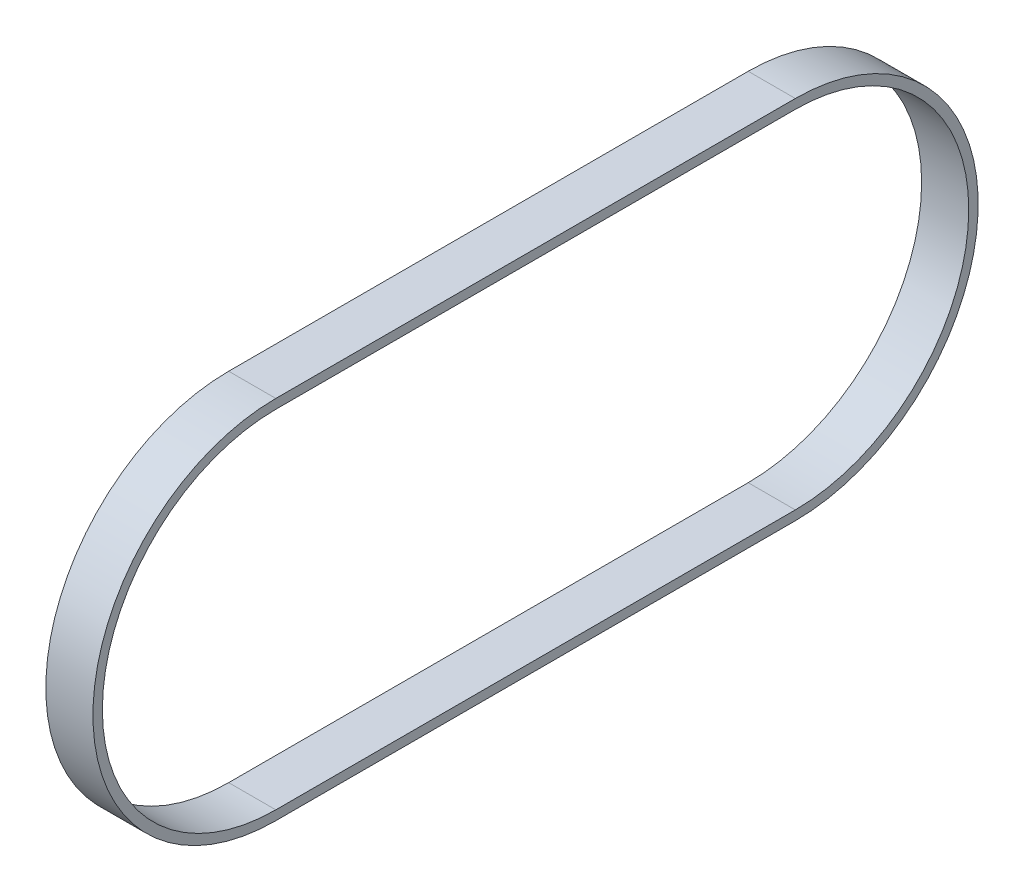
ISO-10303-21;
HEADER;
FILE_DESCRIPTION(('STEP AP214'),'2;1');
FILE_NAME('part.step','',(''),(''),'','','');
FILE_SCHEMA(('AUTOMOTIVE_DESIGN { 1 0 10303 214 1 1 1 1 }'));
ENDSEC;
DATA;
#1=APPLICATION_CONTEXT('core data for automotive mechanical design processes');
#2=APPLICATION_PROTOCOL_DEFINITION('international standard','automotive_design',2000,#1);
#3=PRODUCT_CONTEXT('',#1,'mechanical');
#4=PRODUCT('Part','Part','',(#3));
#5=PRODUCT_RELATED_PRODUCT_CATEGORY('part','',(#4));
#6=PRODUCT_DEFINITION_FORMATION('','',#4);
#7=PRODUCT_DEFINITION_CONTEXT('part definition',#1,'design');
#8=PRODUCT_DEFINITION('design','',#6,#7);
#9=PRODUCT_DEFINITION_SHAPE('','',#8);
#10=(LENGTH_UNIT() NAMED_UNIT(*) SI_UNIT(.MILLI.,.METRE.));
#11=(NAMED_UNIT(*) PLANE_ANGLE_UNIT() SI_UNIT($,.RADIAN.));
#12=(NAMED_UNIT(*) SI_UNIT($,.STERADIAN.) SOLID_ANGLE_UNIT());
#13=UNCERTAINTY_MEASURE_WITH_UNIT(LENGTH_MEASURE(1.E-05),#10,'distance_accuracy_value','');
#14=(GEOMETRIC_REPRESENTATION_CONTEXT(3) GLOBAL_UNCERTAINTY_ASSIGNED_CONTEXT((#13)) GLOBAL_UNIT_ASSIGNED_CONTEXT((#10,
#11,#12)) REPRESENTATION_CONTEXT('',''));
#15=CARTESIAN_POINT('',(0.,0.,0.));
#16=DIRECTION('',(0.,0.,1.));
#17=DIRECTION('',(1.,0.,0.));
#18=AXIS2_PLACEMENT_3D('',#15,#16,#17);
#19=CARTESIAN_POINT('',(3.175,0.,0.));
#20=DIRECTION('',(1.,0.,0.));
#21=DIRECTION('',(0.,0.,-1.));
#22=AXIS2_PLACEMENT_3D('',#19,#20,#21);
#23=PLANE('',#22);
#24=CARTESIAN_POINT('',(3.175,0.,0.));
#25=DIRECTION('',(1.,0.,0.));
#26=DIRECTION('',(0.,0.,-1.));
#27=AXIS2_PLACEMENT_3D('',#24,#25,#26);
#28=CIRCLE('',#27,12.319);
#29=CARTESIAN_POINT('',(3.175,12.319,0.));
#30=VERTEX_POINT('',#29);
#31=CARTESIAN_POINT('',(3.175,-12.319,0.));
#32=VERTEX_POINT('',#31);
#33=EDGE_CURVE('E133',#30,#32,#28,.T.);
#34=ORIENTED_EDGE('',*,*,#33,.T.);
#35=DIRECTION('',(0.,0.,-1.));
#36=VECTOR('',#35,1.);
#37=CARTESIAN_POINT('',(3.175,-12.319,0.));
#38=LINE('',#37,#36);
#39=CARTESIAN_POINT('',(3.175,-12.319,-35.));
#40=VERTEX_POINT('',#39);
#41=EDGE_CURVE('E136',#32,#40,#38,.T.);
#42=ORIENTED_EDGE('',*,*,#41,.T.);
#43=CARTESIAN_POINT('',(3.175,0.,-35.));
#44=DIRECTION('',(1.,0.,0.));
#45=DIRECTION('',(0.,0.,-1.));
#46=AXIS2_PLACEMENT_3D('',#43,#44,#45);
#47=CIRCLE('',#46,12.319);
#48=CARTESIAN_POINT('',(3.175,12.319,-35.));
#49=VERTEX_POINT('',#48);
#50=EDGE_CURVE('E139',#40,#49,#47,.T.);
#51=ORIENTED_EDGE('',*,*,#50,.T.);
#52=DIRECTION('',(0.,0.,1.));
#53=VECTOR('',#52,1.);
#54=CARTESIAN_POINT('',(3.175,12.319,-35.));
#55=LINE('',#54,#53);
#56=EDGE_CURVE('E141',#49,#30,#55,.T.);
#57=ORIENTED_EDGE('',*,*,#56,.T.);
#58=EDGE_LOOP('',(#34,#42,#51,#57));
#59=FACE_BOUND('',#58,.T.);
#60=DIRECTION('',(0.,0.,-1.));
#61=VECTOR('',#60,1.);
#62=CARTESIAN_POINT('',(3.175,-11.684,-35.));
#63=LINE('',#62,#61);
#64=CARTESIAN_POINT('',(3.175,-11.684,0.));
#65=VERTEX_POINT('',#64);
#66=CARTESIAN_POINT('',(3.175,-11.684,-35.));
#67=VERTEX_POINT('',#66);
#68=EDGE_CURVE('E105',#65,#67,#63,.T.);
#69=ORIENTED_EDGE('',*,*,#68,.F.);
#70=CARTESIAN_POINT('',(3.175,0.,0.));
#71=DIRECTION('',(1.,0.,0.));
#72=DIRECTION('',(0.,0.,-1.));
#73=AXIS2_PLACEMENT_3D('',#70,#71,#72);
#74=CIRCLE('',#73,11.684);
#75=CARTESIAN_POINT('',(3.175,11.684,0.));
#76=VERTEX_POINT('',#75);
#77=EDGE_CURVE('E97',#76,#65,#74,.T.);
#78=ORIENTED_EDGE('',*,*,#77,.F.);
#79=DIRECTION('',(0.,0.,1.));
#80=VECTOR('',#79,1.);
#81=CARTESIAN_POINT('',(3.175,11.684,0.));
#82=LINE('',#81,#80);
#83=CARTESIAN_POINT('',(3.175,11.684,-35.));
#84=VERTEX_POINT('',#83);
#85=EDGE_CURVE('E119',#84,#76,#82,.T.);
#86=ORIENTED_EDGE('',*,*,#85,.F.);
#87=CARTESIAN_POINT('',(3.175,0.,-35.));
#88=DIRECTION('',(1.,0.,0.));
#89=DIRECTION('',(0.,0.,1.));
#90=AXIS2_PLACEMENT_3D('',#87,#88,#89);
#91=CIRCLE('',#90,11.684);
#92=EDGE_CURVE('E117',#67,#84,#91,.T.);
#93=ORIENTED_EDGE('',*,*,#92,.F.);
#94=EDGE_LOOP('',(#69,#78,#86,#93));
#95=FACE_BOUND('',#94,.T.);
#96=ADVANCED_FACE('F32',(#59,#95),#23,.T.);
#97=CARTESIAN_POINT('',(0.,0.,0.));
#98=DIRECTION('',(1.,0.,0.));
#99=DIRECTION('',(0.,0.,-1.));
#100=AXIS2_PLACEMENT_3D('',#97,#98,#99);
#101=PLANE('',#100);
#102=CARTESIAN_POINT('',(0.,0.,0.));
#103=DIRECTION('',(1.,0.,0.));
#104=DIRECTION('',(0.,0.,-1.));
#105=AXIS2_PLACEMENT_3D('',#102,#103,#104);
#106=CIRCLE('',#105,12.319);
#107=CARTESIAN_POINT('',(0.,12.319,0.));
#108=VERTEX_POINT('',#107);
#109=CARTESIAN_POINT('',(0.,-12.319,0.));
#110=VERTEX_POINT('',#109);
#111=EDGE_CURVE('E113',#108,#110,#106,.T.);
#112=ORIENTED_EDGE('',*,*,#111,.F.);
#113=DIRECTION('',(0.,0.,1.));
#114=VECTOR('',#113,1.);
#115=CARTESIAN_POINT('',(0.,12.319,-35.));
#116=LINE('',#115,#114);
#117=CARTESIAN_POINT('',(0.,12.319,-35.));
#118=VERTEX_POINT('',#117);
#119=EDGE_CURVE('E137',#118,#108,#116,.T.);
#120=ORIENTED_EDGE('',*,*,#119,.F.);
#121=CARTESIAN_POINT('',(0.,0.,-35.));
#122=DIRECTION('',(1.,0.,0.));
#123=DIRECTION('',(0.,0.,-1.));
#124=AXIS2_PLACEMENT_3D('',#121,#122,#123);
#125=CIRCLE('',#124,12.319);
#126=CARTESIAN_POINT('',(0.,-12.319,-35.));
#127=VERTEX_POINT('',#126);
#128=EDGE_CURVE('E148',#127,#118,#125,.T.);
#129=ORIENTED_EDGE('',*,*,#128,.F.);
#130=DIRECTION('',(0.,0.,-1.));
#131=VECTOR('',#130,1.);
#132=CARTESIAN_POINT('',(0.,-12.319,0.));
#133=LINE('',#132,#131);
#134=EDGE_CURVE('E146',#110,#127,#133,.T.);
#135=ORIENTED_EDGE('',*,*,#134,.F.);
#136=EDGE_LOOP('',(#112,#120,#129,#135));
#137=FACE_BOUND('',#136,.T.);
#138=CARTESIAN_POINT('',(0.,0.,0.));
#139=DIRECTION('',(1.,0.,0.));
#140=DIRECTION('',(0.,0.,-1.));
#141=AXIS2_PLACEMENT_3D('',#138,#139,#140);
#142=CIRCLE('',#141,11.684);
#143=CARTESIAN_POINT('',(0.,11.684,0.));
#144=VERTEX_POINT('',#143);
#145=CARTESIAN_POINT('',(0.,-11.684,0.));
#146=VERTEX_POINT('',#145);
#147=EDGE_CURVE('E55',#144,#146,#142,.T.);
#148=ORIENTED_EDGE('',*,*,#147,.T.);
#149=DIRECTION('',(0.,0.,-1.));
#150=VECTOR('',#149,1.);
#151=CARTESIAN_POINT('',(0.,-11.684,-35.));
#152=LINE('',#151,#150);
#153=CARTESIAN_POINT('',(0.,-11.684,-35.));
#154=VERTEX_POINT('',#153);
#155=EDGE_CURVE('E112',#146,#154,#152,.T.);
#156=ORIENTED_EDGE('',*,*,#155,.T.);
#157=CARTESIAN_POINT('',(0.,0.,-35.));
#158=DIRECTION('',(1.,0.,0.));
#159=DIRECTION('',(0.,0.,1.));
#160=AXIS2_PLACEMENT_3D('',#157,#158,#159);
#161=CIRCLE('',#160,11.684);
#162=CARTESIAN_POINT('',(0.,11.684,-35.));
#163=VERTEX_POINT('',#162);
#164=EDGE_CURVE('E125',#154,#163,#161,.T.);
#165=ORIENTED_EDGE('',*,*,#164,.T.);
#166=DIRECTION('',(0.,0.,1.));
#167=VECTOR('',#166,1.);
#168=CARTESIAN_POINT('',(0.,11.684,0.));
#169=LINE('',#168,#167);
#170=EDGE_CURVE('E106',#163,#144,#169,.T.);
#171=ORIENTED_EDGE('',*,*,#170,.T.);
#172=EDGE_LOOP('',(#148,#156,#165,#171));
#173=FACE_BOUND('',#172,.T.);
#174=ADVANCED_FACE('F166',(#137,#173),#101,.F.);
#175=CARTESIAN_POINT('',(3.175,0.,0.));
#176=DIRECTION('',(-1.,0.,0.));
#177=DIRECTION('',(0.,0.,1.));
#178=AXIS2_PLACEMENT_3D('',#175,#176,#177);
#179=CYLINDRICAL_SURFACE('',#178,12.319);
#180=ORIENTED_EDGE('',*,*,#111,.T.);
#181=DIRECTION('',(-1.,0.,0.));
#182=VECTOR('',#181,1.);
#183=CARTESIAN_POINT('',(3.175,-12.319,0.));
#184=LINE('',#183,#182);
#185=EDGE_CURVE('E11',#32,#110,#184,.T.);
#186=ORIENTED_EDGE('',*,*,#185,.F.);
#187=ORIENTED_EDGE('',*,*,#33,.F.);
#188=DIRECTION('',(-1.,0.,0.));
#189=VECTOR('',#188,1.);
#190=CARTESIAN_POINT('',(3.175,12.319,0.));
#191=LINE('',#190,#189);
#192=EDGE_CURVE('E143',#30,#108,#191,.T.);
#193=ORIENTED_EDGE('',*,*,#192,.T.);
#194=EDGE_LOOP('',(#180,#186,#187,#193));
#195=FACE_BOUND('',#194,.T.);
#196=ADVANCED_FACE('F34',(#195),#179,.T.);
#197=CARTESIAN_POINT('',(3.175,-12.319,0.));
#198=DIRECTION('',(0.,1.,0.));
#199=DIRECTION('',(0.,0.,1.));
#200=AXIS2_PLACEMENT_3D('',#197,#198,#199);
#201=PLANE('',#200);
#202=ORIENTED_EDGE('',*,*,#134,.T.);
#203=DIRECTION('',(-1.,0.,0.));
#204=VECTOR('',#203,1.);
#205=CARTESIAN_POINT('',(3.175,-12.319,-35.));
#206=LINE('',#205,#204);
#207=EDGE_CURVE('E40',#40,#127,#206,.T.);
#208=ORIENTED_EDGE('',*,*,#207,.F.);
#209=ORIENTED_EDGE('',*,*,#41,.F.);
#210=ORIENTED_EDGE('',*,*,#185,.T.);
#211=EDGE_LOOP('',(#202,#208,#209,#210));
#212=FACE_BOUND('',#211,.T.);
#213=ADVANCED_FACE('F176',(#212),#201,.F.);
#214=CARTESIAN_POINT('',(3.175,0.,-35.));
#215=DIRECTION('',(-1.,0.,0.));
#216=DIRECTION('',(0.,0.,1.));
#217=AXIS2_PLACEMENT_3D('',#214,#215,#216);
#218=CYLINDRICAL_SURFACE('',#217,12.319);
#219=ORIENTED_EDGE('',*,*,#128,.T.);
#220=DIRECTION('',(-1.,0.,0.));
#221=VECTOR('',#220,1.);
#222=CARTESIAN_POINT('',(3.175,12.319,-35.));
#223=LINE('',#222,#221);
#224=EDGE_CURVE('E153',#49,#118,#223,.T.);
#225=ORIENTED_EDGE('',*,*,#224,.F.);
#226=ORIENTED_EDGE('',*,*,#50,.F.);
#227=ORIENTED_EDGE('',*,*,#207,.T.);
#228=EDGE_LOOP('',(#219,#225,#226,#227));
#229=FACE_BOUND('',#228,.T.);
#230=ADVANCED_FACE('F160',(#229),#218,.T.);
#231=CARTESIAN_POINT('',(3.175,12.319,-35.));
#232=DIRECTION('',(0.,-1.,0.));
#233=DIRECTION('',(0.,0.,-1.));
#234=AXIS2_PLACEMENT_3D('',#231,#232,#233);
#235=PLANE('',#234);
#236=ORIENTED_EDGE('',*,*,#119,.T.);
#237=ORIENTED_EDGE('',*,*,#192,.F.);
#238=ORIENTED_EDGE('',*,*,#56,.F.);
#239=ORIENTED_EDGE('',*,*,#224,.T.);
#240=EDGE_LOOP('',(#236,#237,#238,#239));
#241=FACE_BOUND('',#240,.T.);
#242=ADVANCED_FACE('F170',(#241),#235,.F.);
#243=CARTESIAN_POINT('',(3.175,0.,0.));
#244=DIRECTION('',(-1.,0.,0.));
#245=DIRECTION('',(0.,0.,1.));
#246=AXIS2_PLACEMENT_3D('',#243,#244,#245);
#247=CYLINDRICAL_SURFACE('',#246,11.684);
#248=ORIENTED_EDGE('',*,*,#147,.F.);
#249=DIRECTION('',(-1.,0.,0.));
#250=VECTOR('',#249,1.);
#251=CARTESIAN_POINT('',(3.175,11.684,0.));
#252=LINE('',#251,#250);
#253=EDGE_CURVE('E101',#76,#144,#252,.T.);
#254=ORIENTED_EDGE('',*,*,#253,.F.);
#255=ORIENTED_EDGE('',*,*,#77,.T.);
#256=DIRECTION('',(-1.,0.,0.));
#257=VECTOR('',#256,1.);
#258=CARTESIAN_POINT('',(3.175,-11.684,0.));
#259=LINE('',#258,#257);
#260=EDGE_CURVE('E100',#65,#146,#259,.T.);
#261=ORIENTED_EDGE('',*,*,#260,.T.);
#262=EDGE_LOOP('',(#248,#254,#255,#261));
#263=FACE_BOUND('',#262,.T.);
#264=ADVANCED_FACE('F99',(#263),#247,.F.);
#265=CARTESIAN_POINT('',(3.175,-11.684,-35.));
#266=DIRECTION('',(0.,1.,0.));
#267=DIRECTION('',(0.,0.,1.));
#268=AXIS2_PLACEMENT_3D('',#265,#266,#267);
#269=PLANE('',#268);
#270=ORIENTED_EDGE('',*,*,#155,.F.);
#271=ORIENTED_EDGE('',*,*,#260,.F.);
#272=ORIENTED_EDGE('',*,*,#68,.T.);
#273=DIRECTION('',(-1.,0.,0.));
#274=VECTOR('',#273,1.);
#275=CARTESIAN_POINT('',(3.175,-11.684,-35.));
#276=LINE('',#275,#274);
#277=EDGE_CURVE('E114',#67,#154,#276,.T.);
#278=ORIENTED_EDGE('',*,*,#277,.T.);
#279=EDGE_LOOP('',(#270,#271,#272,#278));
#280=FACE_BOUND('',#279,.T.);
#281=ADVANCED_FACE('F109',(#280),#269,.T.);
#282=CARTESIAN_POINT('',(3.175,0.,-35.));
#283=DIRECTION('',(-1.,0.,0.));
#284=DIRECTION('',(0.,0.,1.));
#285=AXIS2_PLACEMENT_3D('',#282,#283,#284);
#286=CYLINDRICAL_SURFACE('',#285,11.684);
#287=ORIENTED_EDGE('',*,*,#164,.F.);
#288=ORIENTED_EDGE('',*,*,#277,.F.);
#289=ORIENTED_EDGE('',*,*,#92,.T.);
#290=DIRECTION('',(-1.,0.,0.));
#291=VECTOR('',#290,1.);
#292=CARTESIAN_POINT('',(3.175,11.684,-35.));
#293=LINE('',#292,#291);
#294=EDGE_CURVE('E47',#84,#163,#293,.T.);
#295=ORIENTED_EDGE('',*,*,#294,.T.);
#296=EDGE_LOOP('',(#287,#288,#289,#295));
#297=FACE_BOUND('',#296,.T.);
#298=ADVANCED_FACE('F199',(#297),#286,.F.);
#299=CARTESIAN_POINT('',(3.175,11.684,0.));
#300=DIRECTION('',(0.,-1.,0.));
#301=DIRECTION('',(0.,0.,-1.));
#302=AXIS2_PLACEMENT_3D('',#299,#300,#301);
#303=PLANE('',#302);
#304=ORIENTED_EDGE('',*,*,#170,.F.);
#305=ORIENTED_EDGE('',*,*,#294,.F.);
#306=ORIENTED_EDGE('',*,*,#85,.T.);
#307=ORIENTED_EDGE('',*,*,#253,.T.);
#308=EDGE_LOOP('',(#304,#305,#306,#307));
#309=FACE_BOUND('',#308,.T.);
#310=ADVANCED_FACE('F203',(#309),#303,.T.);
#311=CLOSED_SHELL('',(#96,#174,#196,#213,#230,#242,#264,#281,#298,#310));
#312=MANIFOLD_SOLID_BREP('B2',#311);
#313=ADVANCED_BREP_SHAPE_REPRESENTATION('',(#18,#312),#14);
#314=SHAPE_DEFINITION_REPRESENTATION(#9,#313);
ENDSEC;
END-ISO-10303-21;
